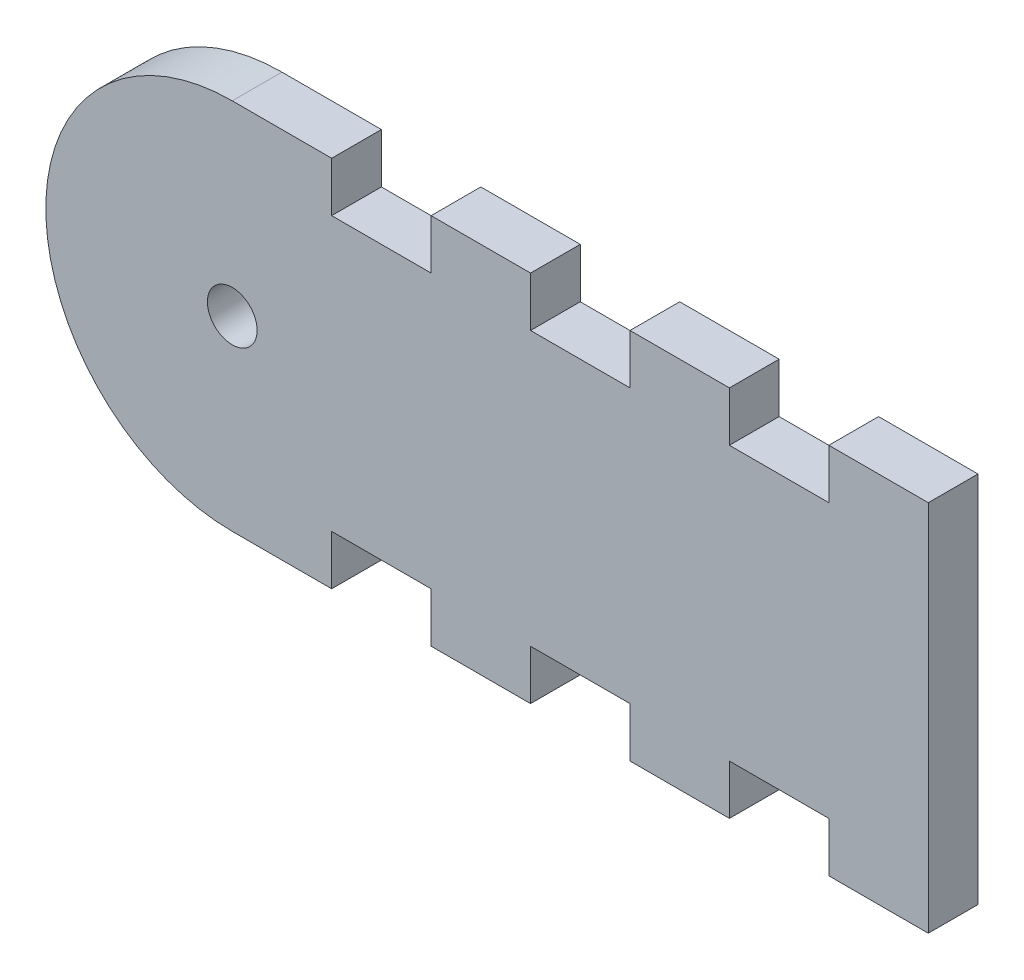
ISO-10303-21;
HEADER;
FILE_DESCRIPTION(('STEP AP214'),'2;1');
FILE_NAME('part.step','',(''),(''),'','','');
FILE_SCHEMA(('AUTOMOTIVE_DESIGN { 1 0 10303 214 1 1 1 1 }'));
ENDSEC;
DATA;
#1=APPLICATION_CONTEXT('core data for automotive mechanical design processes');
#2=APPLICATION_PROTOCOL_DEFINITION('international standard','automotive_design',2000,#1);
#3=PRODUCT_CONTEXT('',#1,'mechanical');
#4=PRODUCT('Part','Part','',(#3));
#5=PRODUCT_RELATED_PRODUCT_CATEGORY('part','',(#4));
#6=PRODUCT_DEFINITION_FORMATION('','',#4);
#7=PRODUCT_DEFINITION_CONTEXT('part definition',#1,'design');
#8=PRODUCT_DEFINITION('design','',#6,#7);
#9=PRODUCT_DEFINITION_SHAPE('','',#8);
#10=(LENGTH_UNIT() NAMED_UNIT(*) SI_UNIT(.MILLI.,.METRE.));
#11=(NAMED_UNIT(*) PLANE_ANGLE_UNIT() SI_UNIT($,.RADIAN.));
#12=(NAMED_UNIT(*) SI_UNIT($,.STERADIAN.) SOLID_ANGLE_UNIT());
#13=UNCERTAINTY_MEASURE_WITH_UNIT(LENGTH_MEASURE(1.E-05),#10,'distance_accuracy_value','');
#14=(GEOMETRIC_REPRESENTATION_CONTEXT(3) GLOBAL_UNCERTAINTY_ASSIGNED_CONTEXT((#13)) GLOBAL_UNIT_ASSIGNED_CONTEXT((#10,
#11,#12)) REPRESENTATION_CONTEXT('',''));
#15=CARTESIAN_POINT('',(0.,0.,0.));
#16=DIRECTION('',(0.,0.,1.));
#17=DIRECTION('',(1.,0.,0.));
#18=AXIS2_PLACEMENT_3D('',#15,#16,#17);
#19=CARTESIAN_POINT('',(-44.45,-23.8125,6.35));
#20=DIRECTION('',(0.,1.,0.));
#21=DIRECTION('',(0.,0.,1.));
#22=AXIS2_PLACEMENT_3D('',#19,#20,#21);
#23=PLANE('',#22);
#24=DIRECTION('',(1.,0.,0.));
#25=VECTOR('',#24,1.);
#26=CARTESIAN_POINT('',(-44.45,-23.8125,6.35));
#27=LINE('',#26,#25);
#28=CARTESIAN_POINT('',(-19.05,-23.8125,6.35));
#29=VERTEX_POINT('',#28);
#30=CARTESIAN_POINT('',(-6.34999999999997,-23.8125,6.35));
#31=VERTEX_POINT('',#30);
#32=EDGE_CURVE('E392',#29,#31,#27,.T.);
#33=ORIENTED_EDGE('',*,*,#32,.F.);
#34=DIRECTION('',(0.,0.,-1.));
#35=VECTOR('',#34,1.);
#36=CARTESIAN_POINT('',(-19.05,-23.8125,6.35));
#37=LINE('',#36,#35);
#38=CARTESIAN_POINT('',(-19.05,-23.8125,0.));
#39=VERTEX_POINT('',#38);
#40=EDGE_CURVE('E248',#29,#39,#37,.T.);
#41=ORIENTED_EDGE('',*,*,#40,.T.);
#42=DIRECTION('',(1.,0.,0.));
#43=VECTOR('',#42,1.);
#44=CARTESIAN_POINT('',(-44.45,-23.8125,0.));
#45=LINE('',#44,#43);
#46=CARTESIAN_POINT('',(-6.34999999999997,-23.8125,0.));
#47=VERTEX_POINT('',#46);
#48=EDGE_CURVE('E405',#39,#47,#45,.T.);
#49=ORIENTED_EDGE('',*,*,#48,.T.);
#50=DIRECTION('',(0.,0.,1.));
#51=VECTOR('',#50,1.);
#52=CARTESIAN_POINT('',(-6.34999999999997,-23.8125,6.35));
#53=LINE('',#52,#51);
#54=EDGE_CURVE('E290',#47,#31,#53,.T.);
#55=ORIENTED_EDGE('',*,*,#54,.T.);
#56=EDGE_LOOP('',(#33,#41,#49,#55));
#57=FACE_BOUND('',#56,.T.);
#58=ADVANCED_FACE('F33',(#57),#23,.F.);
#59=CARTESIAN_POINT('',(-44.45,23.8125,6.35));
#60=DIRECTION('',(0.,-1.,0.));
#61=DIRECTION('',(1.,0.,0.));
#62=AXIS2_PLACEMENT_3D('',#59,#60,#61);
#63=PLANE('',#62);
#64=DIRECTION('',(-1.,0.,0.));
#65=VECTOR('',#64,1.);
#66=CARTESIAN_POINT('',(-44.45,23.8125,0.));
#67=LINE('',#66,#65);
#68=CARTESIAN_POINT('',(-6.34999999999998,23.8125,0.));
#69=VERTEX_POINT('',#68);
#70=CARTESIAN_POINT('',(-19.05,23.8125,0.));
#71=VERTEX_POINT('',#70);
#72=EDGE_CURVE('E436',#69,#71,#67,.T.);
#73=ORIENTED_EDGE('',*,*,#72,.T.);
#74=DIRECTION('',(0.,0.,1.));
#75=VECTOR('',#74,1.);
#76=CARTESIAN_POINT('',(-19.05,23.8125,6.35));
#77=LINE('',#76,#75);
#78=CARTESIAN_POINT('',(-19.05,23.8125,6.35));
#79=VERTEX_POINT('',#78);
#80=EDGE_CURVE('E270',#71,#79,#77,.T.);
#81=ORIENTED_EDGE('',*,*,#80,.T.);
#82=DIRECTION('',(-1.,0.,0.));
#83=VECTOR('',#82,1.);
#84=CARTESIAN_POINT('',(-44.45,23.8125,6.35));
#85=LINE('',#84,#83);
#86=CARTESIAN_POINT('',(-6.34999999999998,23.8125,6.35));
#87=VERTEX_POINT('',#86);
#88=EDGE_CURVE('E512',#87,#79,#85,.T.);
#89=ORIENTED_EDGE('',*,*,#88,.F.);
#90=DIRECTION('',(0.,0.,-1.));
#91=VECTOR('',#90,1.);
#92=CARTESIAN_POINT('',(-6.34999999999998,23.8125,6.35));
#93=LINE('',#92,#91);
#94=EDGE_CURVE('E315',#87,#69,#93,.T.);
#95=ORIENTED_EDGE('',*,*,#94,.T.);
#96=EDGE_LOOP('',(#73,#81,#89,#95));
#97=FACE_BOUND('',#96,.T.);
#98=ADVANCED_FACE('F440',(#97),#63,.F.);
#99=CARTESIAN_POINT('',(6.35000000000002,-23.8125,6.35));
#100=VERTEX_POINT('',#99);
#101=CARTESIAN_POINT('',(19.05,-23.8125,6.35));
#102=VERTEX_POINT('',#101);
#103=EDGE_CURVE('E487',#100,#102,#27,.T.);
#104=ORIENTED_EDGE('',*,*,#103,.F.);
#105=DIRECTION('',(0.,0.,-1.));
#106=VECTOR('',#105,1.);
#107=CARTESIAN_POINT('',(6.35000000000002,-23.8125,6.35));
#108=LINE('',#107,#106);
#109=CARTESIAN_POINT('',(6.35000000000002,-23.8125,0.));
#110=VERTEX_POINT('',#109);
#111=EDGE_CURVE('E295',#100,#110,#108,.T.);
#112=ORIENTED_EDGE('',*,*,#111,.T.);
#113=CARTESIAN_POINT('',(19.05,-23.8125,0.));
#114=VERTEX_POINT('',#113);
#115=EDGE_CURVE('E768',#110,#114,#45,.T.);
#116=ORIENTED_EDGE('',*,*,#115,.T.);
#117=DIRECTION('',(0.,0.,1.));
#118=VECTOR('',#117,1.);
#119=CARTESIAN_POINT('',(19.05,-23.8125,6.35));
#120=LINE('',#119,#118);
#121=EDGE_CURVE('E339',#114,#102,#120,.T.);
#122=ORIENTED_EDGE('',*,*,#121,.T.);
#123=EDGE_LOOP('',(#104,#112,#116,#122));
#124=FACE_BOUND('',#123,.T.);
#125=ADVANCED_FACE('F469',(#124),#23,.F.);
#126=CARTESIAN_POINT('',(19.05,23.8125,0.));
#127=VERTEX_POINT('',#126);
#128=CARTESIAN_POINT('',(6.35000000000002,23.8125,0.));
#129=VERTEX_POINT('',#128);
#130=EDGE_CURVE('E400',#127,#129,#67,.T.);
#131=ORIENTED_EDGE('',*,*,#130,.T.);
#132=DIRECTION('',(0.,0.,1.));
#133=VECTOR('',#132,1.);
#134=CARTESIAN_POINT('',(6.35000000000002,23.8125,6.35));
#135=LINE('',#134,#133);
#136=CARTESIAN_POINT('',(6.35000000000002,23.8125,6.35));
#137=VERTEX_POINT('',#136);
#138=EDGE_CURVE('E319',#129,#137,#135,.T.);
#139=ORIENTED_EDGE('',*,*,#138,.T.);
#140=CARTESIAN_POINT('',(19.05,23.8125,6.35));
#141=VERTEX_POINT('',#140);
#142=EDGE_CURVE('E387',#141,#137,#85,.T.);
#143=ORIENTED_EDGE('',*,*,#142,.F.);
#144=DIRECTION('',(0.,0.,-1.));
#145=VECTOR('',#144,1.);
#146=CARTESIAN_POINT('',(19.05,23.8125,6.35));
#147=LINE('',#146,#145);
#148=EDGE_CURVE('E364',#141,#127,#147,.T.);
#149=ORIENTED_EDGE('',*,*,#148,.T.);
#150=EDGE_LOOP('',(#131,#139,#143,#149));
#151=FACE_BOUND('',#150,.T.);
#152=ADVANCED_FACE('F472',(#151),#63,.F.);
#153=CARTESIAN_POINT('',(31.75,-23.8125,6.35));
#154=VERTEX_POINT('',#153);
#155=CARTESIAN_POINT('',(44.45,-23.8125,6.35));
#156=VERTEX_POINT('',#155);
#157=EDGE_CURVE('E389',#154,#156,#27,.T.);
#158=ORIENTED_EDGE('',*,*,#157,.F.);
#159=DIRECTION('',(0.,0.,-1.));
#160=VECTOR('',#159,1.);
#161=CARTESIAN_POINT('',(31.75,-23.8125,6.35));
#162=LINE('',#161,#160);
#163=CARTESIAN_POINT('',(31.75,-23.8125,0.));
#164=VERTEX_POINT('',#163);
#165=EDGE_CURVE('E344',#154,#164,#162,.T.);
#166=ORIENTED_EDGE('',*,*,#165,.T.);
#167=CARTESIAN_POINT('',(44.45,-23.8125,0.));
#168=VERTEX_POINT('',#167);
#169=EDGE_CURVE('E402',#164,#168,#45,.T.);
#170=ORIENTED_EDGE('',*,*,#169,.T.);
#171=DIRECTION('',(0.,0.,-1.));
#172=VECTOR('',#171,1.);
#173=CARTESIAN_POINT('',(44.45,-23.8125,6.35));
#174=LINE('',#173,#172);
#175=EDGE_CURVE('E391',#156,#168,#174,.T.);
#176=ORIENTED_EDGE('',*,*,#175,.F.);
#177=EDGE_LOOP('',(#158,#166,#170,#176));
#178=FACE_BOUND('',#177,.T.);
#179=ADVANCED_FACE('F459',(#178),#23,.F.);
#180=CARTESIAN_POINT('',(44.45,23.8125,0.));
#181=VERTEX_POINT('',#180);
#182=CARTESIAN_POINT('',(31.75,23.8125,0.));
#183=VERTEX_POINT('',#182);
#184=EDGE_CURVE('E396',#181,#183,#67,.T.);
#185=ORIENTED_EDGE('',*,*,#184,.T.);
#186=DIRECTION('',(0.,0.,1.));
#187=VECTOR('',#186,1.);
#188=CARTESIAN_POINT('',(31.75,23.8125,6.35));
#189=LINE('',#188,#187);
#190=CARTESIAN_POINT('',(31.75,23.8125,6.35));
#191=VERTEX_POINT('',#190);
#192=EDGE_CURVE('E368',#183,#191,#189,.T.);
#193=ORIENTED_EDGE('',*,*,#192,.T.);
#194=CARTESIAN_POINT('',(44.45,23.8125,6.35));
#195=VERTEX_POINT('',#194);
#196=EDGE_CURVE('E383',#195,#191,#85,.T.);
#197=ORIENTED_EDGE('',*,*,#196,.F.);
#198=DIRECTION('',(0.,0.,-1.));
#199=VECTOR('',#198,1.);
#200=CARTESIAN_POINT('',(44.45,23.8125,6.35));
#201=LINE('',#200,#199);
#202=EDGE_CURVE('E414',#195,#181,#201,.T.);
#203=ORIENTED_EDGE('',*,*,#202,.T.);
#204=EDGE_LOOP('',(#185,#193,#197,#203));
#205=FACE_BOUND('',#204,.T.);
#206=ADVANCED_FACE('F471',(#205),#63,.F.);
#207=CARTESIAN_POINT('',(44.45,-23.8125,6.35));
#208=DIRECTION('',(-1.,0.,0.));
#209=DIRECTION('',(0.,-1.,0.));
#210=AXIS2_PLACEMENT_3D('',#207,#208,#209);
#211=PLANE('',#210);
#212=DIRECTION('',(0.,1.,0.));
#213=VECTOR('',#212,1.);
#214=CARTESIAN_POINT('',(44.45,-23.8125,0.));
#215=LINE('',#214,#213);
#216=EDGE_CURVE('E375',#168,#181,#215,.T.);
#217=ORIENTED_EDGE('',*,*,#216,.T.);
#218=ORIENTED_EDGE('',*,*,#202,.F.);
#219=DIRECTION('',(0.,1.,0.));
#220=VECTOR('',#219,1.);
#221=CARTESIAN_POINT('',(44.45,-23.8125,6.35));
#222=LINE('',#221,#220);
#223=EDGE_CURVE('E378',#156,#195,#222,.T.);
#224=ORIENTED_EDGE('',*,*,#223,.F.);
#225=ORIENTED_EDGE('',*,*,#175,.T.);
#226=EDGE_LOOP('',(#217,#218,#224,#225));
#227=FACE_BOUND('',#226,.T.);
#228=ADVANCED_FACE('F35',(#227),#211,.F.);
#229=CARTESIAN_POINT('',(-31.75,23.8125,6.35));
#230=VERTEX_POINT('',#229);
#231=CARTESIAN_POINT('',(-44.45,23.8125,6.35));
#232=VERTEX_POINT('',#231);
#233=EDGE_CURVE('E381',#230,#232,#85,.T.);
#234=ORIENTED_EDGE('',*,*,#233,.F.);
#235=DIRECTION('',(0.,0.,-1.));
#236=VECTOR('',#235,1.);
#237=CARTESIAN_POINT('',(-31.75,23.8125,6.35));
#238=LINE('',#237,#236);
#239=CARTESIAN_POINT('',(-31.75,23.8125,0.));
#240=VERTEX_POINT('',#239);
#241=EDGE_CURVE('E266',#230,#240,#238,.T.);
#242=ORIENTED_EDGE('',*,*,#241,.T.);
#243=CARTESIAN_POINT('',(-44.45,23.8125,0.));
#244=VERTEX_POINT('',#243);
#245=EDGE_CURVE('E395',#240,#244,#67,.T.);
#246=ORIENTED_EDGE('',*,*,#245,.T.);
#247=DIRECTION('',(0.,0.,-1.));
#248=VECTOR('',#247,1.);
#249=CARTESIAN_POINT('',(-44.45,23.8125,6.35));
#250=LINE('',#249,#248);
#251=EDGE_CURVE('E411',#232,#244,#250,.T.);
#252=ORIENTED_EDGE('',*,*,#251,.F.);
#253=EDGE_LOOP('',(#234,#242,#246,#252));
#254=FACE_BOUND('',#253,.T.);
#255=ADVANCED_FACE('F448',(#254),#63,.F.);
#256=CARTESIAN_POINT('',(-44.45,0.,6.35));
#257=DIRECTION('',(0.,0.,-1.));
#258=DIRECTION('',(-1.,0.,0.));
#259=AXIS2_PLACEMENT_3D('',#256,#257,#258);
#260=CYLINDRICAL_SURFACE('',#259,23.8125);
#261=CARTESIAN_POINT('',(-44.45,0.,0.));
#262=DIRECTION('',(0.,0.,1.));
#263=DIRECTION('',(1.,0.,0.));
#264=AXIS2_PLACEMENT_3D('',#261,#262,#263);
#265=CIRCLE('',#264,23.8125);
#266=CARTESIAN_POINT('',(-44.45,-23.8125,0.));
#267=VERTEX_POINT('',#266);
#268=EDGE_CURVE('E399',#244,#267,#265,.T.);
#269=ORIENTED_EDGE('',*,*,#268,.T.);
#270=DIRECTION('',(0.,0.,-1.));
#271=VECTOR('',#270,1.);
#272=CARTESIAN_POINT('',(-44.45,-23.8125,6.35));
#273=LINE('',#272,#271);
#274=CARTESIAN_POINT('',(-44.45,-23.8125,6.35));
#275=VERTEX_POINT('',#274);
#276=EDGE_CURVE('E408',#275,#267,#273,.T.);
#277=ORIENTED_EDGE('',*,*,#276,.F.);
#278=CARTESIAN_POINT('',(-44.45,0.,6.35));
#279=DIRECTION('',(0.,0.,1.));
#280=DIRECTION('',(1.,0.,0.));
#281=AXIS2_PLACEMENT_3D('',#278,#279,#280);
#282=CIRCLE('',#281,23.8125);
#283=EDGE_CURVE('E386',#232,#275,#282,.T.);
#284=ORIENTED_EDGE('',*,*,#283,.F.);
#285=ORIENTED_EDGE('',*,*,#251,.T.);
#286=EDGE_LOOP('',(#269,#277,#284,#285));
#287=FACE_BOUND('',#286,.T.);
#288=ADVANCED_FACE('F452',(#287),#260,.T.);
#289=CARTESIAN_POINT('',(-31.75,-23.8125,0.));
#290=VERTEX_POINT('',#289);
#291=EDGE_CURVE('E382',#267,#290,#45,.T.);
#292=ORIENTED_EDGE('',*,*,#291,.T.);
#293=DIRECTION('',(0.,0.,1.));
#294=VECTOR('',#293,1.);
#295=CARTESIAN_POINT('',(-31.75,-23.8125,6.35));
#296=LINE('',#295,#294);
#297=CARTESIAN_POINT('',(-31.75,-23.8125,6.35));
#298=VERTEX_POINT('',#297);
#299=EDGE_CURVE('E48',#290,#298,#296,.T.);
#300=ORIENTED_EDGE('',*,*,#299,.T.);
#301=EDGE_CURVE('E237',#275,#298,#27,.T.);
#302=ORIENTED_EDGE('',*,*,#301,.F.);
#303=ORIENTED_EDGE('',*,*,#276,.T.);
#304=EDGE_LOOP('',(#292,#300,#302,#303));
#305=FACE_BOUND('',#304,.T.);
#306=ADVANCED_FACE('F456',(#305),#23,.F.);
#307=CARTESIAN_POINT('',(-44.45,0.,6.35));
#308=DIRECTION('',(0.,0.,1.));
#309=DIRECTION('',(1.,0.,0.));
#310=AXIS2_PLACEMENT_3D('',#307,#308,#309);
#311=PLANE('',#310);
#312=DIRECTION('',(0.,-1.,0.));
#313=VECTOR('',#312,1.);
#314=CARTESIAN_POINT('',(-19.05,-30.1625,6.35));
#315=LINE('',#314,#313);
#316=CARTESIAN_POINT('',(-19.05,-17.4625,6.35));
#317=VERTEX_POINT('',#316);
#318=EDGE_CURVE('E238',#317,#29,#315,.T.);
#319=ORIENTED_EDGE('',*,*,#318,.T.);
#320=ORIENTED_EDGE('',*,*,#32,.T.);
#321=DIRECTION('',(0.,1.,0.));
#322=VECTOR('',#321,1.);
#323=CARTESIAN_POINT('',(-6.34999999999996,-30.1625,6.35));
#324=LINE('',#323,#322);
#325=CARTESIAN_POINT('',(-6.34999999999997,-17.4625,6.35));
#326=VERTEX_POINT('',#325);
#327=EDGE_CURVE('E277',#31,#326,#324,.T.);
#328=ORIENTED_EDGE('',*,*,#327,.T.);
#329=DIRECTION('',(1.,0.,0.));
#330=VECTOR('',#329,1.);
#331=CARTESIAN_POINT('',(-6.34999999999997,-17.4625,6.35));
#332=LINE('',#331,#330);
#333=CARTESIAN_POINT('',(6.35000000000002,-17.4625,6.35));
#334=VERTEX_POINT('',#333);
#335=EDGE_CURVE('E281',#326,#334,#332,.T.);
#336=ORIENTED_EDGE('',*,*,#335,.T.);
#337=DIRECTION('',(0.,-1.,0.));
#338=VECTOR('',#337,1.);
#339=CARTESIAN_POINT('',(6.35000000000002,-30.1625,6.35));
#340=LINE('',#339,#338);
#341=EDGE_CURVE('E274',#334,#100,#340,.T.);
#342=ORIENTED_EDGE('',*,*,#341,.T.);
#343=ORIENTED_EDGE('',*,*,#103,.T.);
#344=DIRECTION('',(0.,1.,0.));
#345=VECTOR('',#344,1.);
#346=CARTESIAN_POINT('',(19.05,-30.1625,6.35));
#347=LINE('',#346,#345);
#348=CARTESIAN_POINT('',(19.05,-17.4625,6.35));
#349=VERTEX_POINT('',#348);
#350=EDGE_CURVE('E326',#102,#349,#347,.T.);
#351=ORIENTED_EDGE('',*,*,#350,.T.);
#352=DIRECTION('',(1.,0.,0.));
#353=VECTOR('',#352,1.);
#354=CARTESIAN_POINT('',(19.05,-17.4625,6.35));
#355=LINE('',#354,#353);
#356=CARTESIAN_POINT('',(31.75,-17.4625,6.35));
#357=VERTEX_POINT('',#356);
#358=EDGE_CURVE('E330',#349,#357,#355,.T.);
#359=ORIENTED_EDGE('',*,*,#358,.T.);
#360=DIRECTION('',(0.,-1.,0.));
#361=VECTOR('',#360,1.);
#362=CARTESIAN_POINT('',(31.75,-30.1625,6.35));
#363=LINE('',#362,#361);
#364=EDGE_CURVE('E323',#357,#154,#363,.T.);
#365=ORIENTED_EDGE('',*,*,#364,.T.);
#366=ORIENTED_EDGE('',*,*,#157,.T.);
#367=ORIENTED_EDGE('',*,*,#223,.T.);
#368=ORIENTED_EDGE('',*,*,#196,.T.);
#369=DIRECTION('',(0.,-1.,0.));
#370=VECTOR('',#369,1.);
#371=CARTESIAN_POINT('',(31.75,17.4625,6.35));
#372=LINE('',#371,#370);
#373=CARTESIAN_POINT('',(31.75,17.4625,6.35));
#374=VERTEX_POINT('',#373);
#375=EDGE_CURVE('E348',#191,#374,#372,.T.);
#376=ORIENTED_EDGE('',*,*,#375,.T.);
#377=DIRECTION('',(-1.,0.,0.));
#378=VECTOR('',#377,1.);
#379=CARTESIAN_POINT('',(19.05,17.4625,6.35));
#380=LINE('',#379,#378);
#381=CARTESIAN_POINT('',(19.05,17.4625,6.35));
#382=VERTEX_POINT('',#381);
#383=EDGE_CURVE('E351',#374,#382,#380,.T.);
#384=ORIENTED_EDGE('',*,*,#383,.T.);
#385=DIRECTION('',(0.,1.,0.));
#386=VECTOR('',#385,1.);
#387=CARTESIAN_POINT('',(19.05,17.4625,6.35));
#388=LINE('',#387,#386);
#389=EDGE_CURVE('E355',#382,#141,#388,.T.);
#390=ORIENTED_EDGE('',*,*,#389,.T.);
#391=ORIENTED_EDGE('',*,*,#142,.T.);
#392=DIRECTION('',(0.,-1.,0.));
#393=VECTOR('',#392,1.);
#394=CARTESIAN_POINT('',(6.35000000000002,17.4625,6.35));
#395=LINE('',#394,#393);
#396=CARTESIAN_POINT('',(6.35000000000002,17.4625,6.35));
#397=VERTEX_POINT('',#396);
#398=EDGE_CURVE('E299',#137,#397,#395,.T.);
#399=ORIENTED_EDGE('',*,*,#398,.T.);
#400=DIRECTION('',(-1.,0.,0.));
#401=VECTOR('',#400,1.);
#402=CARTESIAN_POINT('',(-6.34999999999998,17.4625,6.35));
#403=LINE('',#402,#401);
#404=CARTESIAN_POINT('',(-6.34999999999998,17.4625,6.35));
#405=VERTEX_POINT('',#404);
#406=EDGE_CURVE('E302',#397,#405,#403,.T.);
#407=ORIENTED_EDGE('',*,*,#406,.T.);
#408=DIRECTION('',(0.,1.,0.));
#409=VECTOR('',#408,1.);
#410=CARTESIAN_POINT('',(-6.34999999999998,17.4625,6.35));
#411=LINE('',#410,#409);
#412=EDGE_CURVE('E306',#405,#87,#411,.T.);
#413=ORIENTED_EDGE('',*,*,#412,.T.);
#414=ORIENTED_EDGE('',*,*,#88,.T.);
#415=DIRECTION('',(0.,-1.,0.));
#416=VECTOR('',#415,1.);
#417=CARTESIAN_POINT('',(-19.05,17.4625,6.35));
#418=LINE('',#417,#416);
#419=CARTESIAN_POINT('',(-19.05,17.4625,6.35));
#420=VERTEX_POINT('',#419);
#421=EDGE_CURVE('E252',#79,#420,#418,.T.);
#422=ORIENTED_EDGE('',*,*,#421,.T.);
#423=DIRECTION('',(-1.,0.,0.));
#424=VECTOR('',#423,1.);
#425=CARTESIAN_POINT('',(-31.75,17.4625,6.35));
#426=LINE('',#425,#424);
#427=CARTESIAN_POINT('',(-31.75,17.4625,6.35));
#428=VERTEX_POINT('',#427);
#429=EDGE_CURVE('E255',#420,#428,#426,.T.);
#430=ORIENTED_EDGE('',*,*,#429,.T.);
#431=DIRECTION('',(0.,1.,0.));
#432=VECTOR('',#431,1.);
#433=CARTESIAN_POINT('',(-31.75,17.4625,6.35));
#434=LINE('',#433,#432);
#435=EDGE_CURVE('E259',#428,#230,#434,.T.);
#436=ORIENTED_EDGE('',*,*,#435,.T.);
#437=ORIENTED_EDGE('',*,*,#233,.T.);
#438=ORIENTED_EDGE('',*,*,#283,.T.);
#439=ORIENTED_EDGE('',*,*,#301,.T.);
#440=DIRECTION('',(0.,1.,0.));
#441=VECTOR('',#440,1.);
#442=CARTESIAN_POINT('',(-31.75,-30.1625,6.35));
#443=LINE('',#442,#441);
#444=CARTESIAN_POINT('',(-31.75,-17.4625,6.35));
#445=VERTEX_POINT('',#444);
#446=EDGE_CURVE('E220',#298,#445,#443,.T.);
#447=ORIENTED_EDGE('',*,*,#446,.T.);
#448=DIRECTION('',(1.,0.,0.));
#449=VECTOR('',#448,1.);
#450=CARTESIAN_POINT('',(-31.75,-17.4625,6.35));
#451=LINE('',#450,#449);
#452=EDGE_CURVE('E225',#445,#317,#451,.T.);
#453=ORIENTED_EDGE('',*,*,#452,.T.);
#454=EDGE_LOOP('',(#319,#320,#328,#336,#342,#343,#351,#359,#365,#366,#367,#368,#376,#384,#390,
#391,#399,#407,#413,#414,#422,#430,#436,#437,#438,#439,#447,#453));
#455=FACE_BOUND('',#454,.T.);
#456=CARTESIAN_POINT('',(-44.45,0.,6.35));
#457=DIRECTION('',(0.,0.,-1.));
#458=DIRECTION('',(-1.,0.,0.));
#459=AXIS2_PLACEMENT_3D('',#456,#457,#458);
#460=CIRCLE('',#459,3.175);
#461=CARTESIAN_POINT('',(-47.625,0.,6.35));
#462=VERTEX_POINT('',#461);
#463=EDGE_CURVE('E372',#462,#462,#460,.T.);
#464=ORIENTED_EDGE('',*,*,#463,.T.);
#465=EDGE_LOOP('',(#464));
#466=FACE_BOUND('',#465,.T.);
#467=ADVANCED_FACE('F234',(#455,#466),#311,.T.);
#468=CARTESIAN_POINT('',(-44.45,0.,0.));
#469=DIRECTION('',(0.,0.,1.));
#470=DIRECTION('',(1.,0.,0.));
#471=AXIS2_PLACEMENT_3D('',#468,#469,#470);
#472=PLANE('',#471);
#473=CARTESIAN_POINT('',(-44.45,0.,0.));
#474=DIRECTION('',(0.,0.,-1.));
#475=DIRECTION('',(-1.,0.,0.));
#476=AXIS2_PLACEMENT_3D('',#473,#474,#475);
#477=CIRCLE('',#476,3.175);
#478=CARTESIAN_POINT('',(-47.625,0.,0.));
#479=VERTEX_POINT('',#478);
#480=EDGE_CURVE('E371',#479,#479,#477,.T.);
#481=ORIENTED_EDGE('',*,*,#480,.F.);
#482=EDGE_LOOP('',(#481));
#483=FACE_BOUND('',#482,.T.);
#484=ORIENTED_EDGE('',*,*,#48,.F.);
#485=DIRECTION('',(0.,-1.,0.));
#486=VECTOR('',#485,1.);
#487=CARTESIAN_POINT('',(-19.05,-30.1625,0.));
#488=LINE('',#487,#486);
#489=CARTESIAN_POINT('',(-19.05,-17.4625,0.));
#490=VERTEX_POINT('',#489);
#491=EDGE_CURVE('E243',#490,#39,#488,.T.);
#492=ORIENTED_EDGE('',*,*,#491,.F.);
#493=DIRECTION('',(1.,0.,0.));
#494=VECTOR('',#493,1.);
#495=CARTESIAN_POINT('',(-31.75,-17.4625,0.));
#496=LINE('',#495,#494);
#497=CARTESIAN_POINT('',(-31.75,-17.4625,0.));
#498=VERTEX_POINT('',#497);
#499=EDGE_CURVE('E240',#498,#490,#496,.T.);
#500=ORIENTED_EDGE('',*,*,#499,.F.);
#501=DIRECTION('',(0.,-1.,0.));
#502=VECTOR('',#501,1.);
#503=CARTESIAN_POINT('',(-31.75,0.,0.));
#504=LINE('',#503,#502);
#505=EDGE_CURVE('E11',#498,#290,#504,.T.);
#506=ORIENTED_EDGE('',*,*,#505,.T.);
#507=ORIENTED_EDGE('',*,*,#291,.F.);
#508=ORIENTED_EDGE('',*,*,#268,.F.);
#509=ORIENTED_EDGE('',*,*,#245,.F.);
#510=DIRECTION('',(0.,1.,0.));
#511=VECTOR('',#510,1.);
#512=CARTESIAN_POINT('',(-31.75,17.4625,0.));
#513=LINE('',#512,#511);
#514=CARTESIAN_POINT('',(-31.75,17.4625,0.));
#515=VERTEX_POINT('',#514);
#516=EDGE_CURVE('E256',#515,#240,#513,.T.);
#517=ORIENTED_EDGE('',*,*,#516,.F.);
#518=DIRECTION('',(-1.,0.,0.));
#519=VECTOR('',#518,1.);
#520=CARTESIAN_POINT('',(-31.75,17.4625,0.));
#521=LINE('',#520,#519);
#522=CARTESIAN_POINT('',(-19.05,17.4625,0.));
#523=VERTEX_POINT('',#522);
#524=EDGE_CURVE('E251',#523,#515,#521,.T.);
#525=ORIENTED_EDGE('',*,*,#524,.F.);
#526=DIRECTION('',(0.,1.,0.));
#527=VECTOR('',#526,1.);
#528=CARTESIAN_POINT('',(-19.05,0.,0.));
#529=LINE('',#528,#527);
#530=EDGE_CURVE('E41',#523,#71,#529,.T.);
#531=ORIENTED_EDGE('',*,*,#530,.T.);
#532=ORIENTED_EDGE('',*,*,#72,.F.);
#533=DIRECTION('',(0.,1.,0.));
#534=VECTOR('',#533,1.);
#535=CARTESIAN_POINT('',(-6.34999999999998,17.4625,0.));
#536=LINE('',#535,#534);
#537=CARTESIAN_POINT('',(-6.34999999999998,17.4625,0.));
#538=VERTEX_POINT('',#537);
#539=EDGE_CURVE('E303',#538,#69,#536,.T.);
#540=ORIENTED_EDGE('',*,*,#539,.F.);
#541=DIRECTION('',(-1.,0.,0.));
#542=VECTOR('',#541,1.);
#543=CARTESIAN_POINT('',(-6.34999999999998,17.4625,0.));
#544=LINE('',#543,#542);
#545=CARTESIAN_POINT('',(6.35000000000002,17.4625,0.));
#546=VERTEX_POINT('',#545);
#547=EDGE_CURVE('E298',#546,#538,#544,.T.);
#548=ORIENTED_EDGE('',*,*,#547,.F.);
#549=DIRECTION('',(0.,1.,0.));
#550=VECTOR('',#549,1.);
#551=CARTESIAN_POINT('',(6.35000000000001,0.,0.));
#552=LINE('',#551,#550);
#553=EDGE_CURVE('E423',#546,#129,#552,.T.);
#554=ORIENTED_EDGE('',*,*,#553,.T.);
#555=ORIENTED_EDGE('',*,*,#130,.F.);
#556=DIRECTION('',(0.,1.,0.));
#557=VECTOR('',#556,1.);
#558=CARTESIAN_POINT('',(19.05,17.4625,0.));
#559=LINE('',#558,#557);
#560=CARTESIAN_POINT('',(19.05,17.4625,0.));
#561=VERTEX_POINT('',#560);
#562=EDGE_CURVE('E352',#561,#127,#559,.T.);
#563=ORIENTED_EDGE('',*,*,#562,.F.);
#564=DIRECTION('',(-1.,0.,0.));
#565=VECTOR('',#564,1.);
#566=CARTESIAN_POINT('',(19.05,17.4625,0.));
#567=LINE('',#566,#565);
#568=CARTESIAN_POINT('',(31.75,17.4625,0.));
#569=VERTEX_POINT('',#568);
#570=EDGE_CURVE('E347',#569,#561,#567,.T.);
#571=ORIENTED_EDGE('',*,*,#570,.F.);
#572=DIRECTION('',(0.,1.,0.));
#573=VECTOR('',#572,1.);
#574=CARTESIAN_POINT('',(31.75,0.,0.));
#575=LINE('',#574,#573);
#576=EDGE_CURVE('E417',#569,#183,#575,.T.);
#577=ORIENTED_EDGE('',*,*,#576,.T.);
#578=ORIENTED_EDGE('',*,*,#184,.F.);
#579=ORIENTED_EDGE('',*,*,#216,.F.);
#580=ORIENTED_EDGE('',*,*,#169,.F.);
#581=DIRECTION('',(0.,-1.,0.));
#582=VECTOR('',#581,1.);
#583=CARTESIAN_POINT('',(31.75,-30.1625,0.));
#584=LINE('',#583,#582);
#585=CARTESIAN_POINT('',(31.75,-17.4625,0.));
#586=VERTEX_POINT('',#585);
#587=EDGE_CURVE('E322',#586,#164,#584,.T.);
#588=ORIENTED_EDGE('',*,*,#587,.F.);
#589=DIRECTION('',(1.,0.,0.));
#590=VECTOR('',#589,1.);
#591=CARTESIAN_POINT('',(19.05,-17.4625,0.));
#592=LINE('',#591,#590);
#593=CARTESIAN_POINT('',(19.05,-17.4625,0.));
#594=VERTEX_POINT('',#593);
#595=EDGE_CURVE('E327',#594,#586,#592,.T.);
#596=ORIENTED_EDGE('',*,*,#595,.F.);
#597=DIRECTION('',(0.,-1.,0.));
#598=VECTOR('',#597,1.);
#599=CARTESIAN_POINT('',(19.05,0.,0.));
#600=LINE('',#599,#598);
#601=EDGE_CURVE('E420',#594,#114,#600,.T.);
#602=ORIENTED_EDGE('',*,*,#601,.T.);
#603=ORIENTED_EDGE('',*,*,#115,.F.);
#604=DIRECTION('',(0.,-1.,0.));
#605=VECTOR('',#604,1.);
#606=CARTESIAN_POINT('',(6.35000000000002,-30.1625,0.));
#607=LINE('',#606,#605);
#608=CARTESIAN_POINT('',(6.35000000000002,-17.4625,0.));
#609=VERTEX_POINT('',#608);
#610=EDGE_CURVE('E273',#609,#110,#607,.T.);
#611=ORIENTED_EDGE('',*,*,#610,.F.);
#612=DIRECTION('',(1.,0.,0.));
#613=VECTOR('',#612,1.);
#614=CARTESIAN_POINT('',(-6.34999999999997,-17.4625,0.));
#615=LINE('',#614,#613);
#616=CARTESIAN_POINT('',(-6.34999999999997,-17.4625,0.));
#617=VERTEX_POINT('',#616);
#618=EDGE_CURVE('E278',#617,#609,#615,.T.);
#619=ORIENTED_EDGE('',*,*,#618,.F.);
#620=DIRECTION('',(0.,-1.,0.));
#621=VECTOR('',#620,1.);
#622=CARTESIAN_POINT('',(-6.34999999999999,0.,0.));
#623=LINE('',#622,#621);
#624=EDGE_CURVE('E426',#617,#47,#623,.T.);
#625=ORIENTED_EDGE('',*,*,#624,.T.);
#626=EDGE_LOOP('',(#484,#492,#500,#506,#507,#508,#509,#517,#525,#531,#532,#540,#548,#554,#555,
#563,#571,#577,#578,#579,#580,#588,#596,#602,#603,#611,#619,#625));
#627=FACE_BOUND('',#626,.T.);
#628=ADVANCED_FACE('F434',(#483,#627),#472,.F.);
#629=CARTESIAN_POINT('',(-44.45,0.,6.35));
#630=DIRECTION('',(0.,0.,-1.));
#631=DIRECTION('',(-1.,0.,0.));
#632=AXIS2_PLACEMENT_3D('',#629,#630,#631);
#633=CYLINDRICAL_SURFACE('',#632,3.175);
#634=ORIENTED_EDGE('',*,*,#463,.F.);
#635=EDGE_LOOP('',(#634));
#636=FACE_BOUND('',#635,.T.);
#637=ORIENTED_EDGE('',*,*,#480,.T.);
#638=EDGE_LOOP('',(#637));
#639=FACE_BOUND('',#638,.T.);
#640=ADVANCED_FACE('F573',(#636,#639),#633,.F.);
#641=CARTESIAN_POINT('',(31.75,17.4625,6.35));
#642=DIRECTION('',(1.,0.,0.));
#643=DIRECTION('',(0.,1.,0.));
#644=AXIS2_PLACEMENT_3D('',#641,#642,#643);
#645=PLANE('',#644);
#646=ORIENTED_EDGE('',*,*,#576,.F.);
#647=DIRECTION('',(0.,0.,-1.));
#648=VECTOR('',#647,1.);
#649=CARTESIAN_POINT('',(31.75,17.4625,6.35));
#650=LINE('',#649,#648);
#651=EDGE_CURVE('E358',#374,#569,#650,.T.);
#652=ORIENTED_EDGE('',*,*,#651,.F.);
#653=ORIENTED_EDGE('',*,*,#375,.F.);
#654=ORIENTED_EDGE('',*,*,#192,.F.);
#655=EDGE_LOOP('',(#646,#652,#653,#654));
#656=FACE_BOUND('',#655,.T.);
#657=ADVANCED_FACE('F501',(#656),#645,.F.);
#658=CARTESIAN_POINT('',(19.05,17.4625,6.35));
#659=DIRECTION('',(-1.,0.,0.));
#660=DIRECTION('',(0.,-1.,0.));
#661=AXIS2_PLACEMENT_3D('',#658,#659,#660);
#662=PLANE('',#661);
#663=ORIENTED_EDGE('',*,*,#389,.F.);
#664=DIRECTION('',(0.,0.,-1.));
#665=VECTOR('',#664,1.);
#666=CARTESIAN_POINT('',(19.05,17.4625,6.35));
#667=LINE('',#666,#665);
#668=EDGE_CURVE('E362',#382,#561,#667,.T.);
#669=ORIENTED_EDGE('',*,*,#668,.T.);
#670=ORIENTED_EDGE('',*,*,#562,.T.);
#671=ORIENTED_EDGE('',*,*,#148,.F.);
#672=EDGE_LOOP('',(#663,#669,#670,#671));
#673=FACE_BOUND('',#672,.T.);
#674=ADVANCED_FACE('F508',(#673),#662,.F.);
#675=CARTESIAN_POINT('',(19.05,17.4625,6.35));
#676=DIRECTION('',(0.,-1.,0.));
#677=DIRECTION('',(0.,0.,-1.));
#678=AXIS2_PLACEMENT_3D('',#675,#676,#677);
#679=PLANE('',#678);
#680=ORIENTED_EDGE('',*,*,#570,.T.);
#681=ORIENTED_EDGE('',*,*,#668,.F.);
#682=ORIENTED_EDGE('',*,*,#383,.F.);
#683=ORIENTED_EDGE('',*,*,#651,.T.);
#684=EDGE_LOOP('',(#680,#681,#682,#683));
#685=FACE_BOUND('',#684,.T.);
#686=ADVANCED_FACE('F504',(#685),#679,.F.);
#687=CARTESIAN_POINT('',(31.75,-30.1625,6.35));
#688=DIRECTION('',(1.,0.,0.));
#689=DIRECTION('',(0.,0.,-1.));
#690=AXIS2_PLACEMENT_3D('',#687,#688,#689);
#691=PLANE('',#690);
#692=ORIENTED_EDGE('',*,*,#364,.F.);
#693=DIRECTION('',(0.,0.,-1.));
#694=VECTOR('',#693,1.);
#695=CARTESIAN_POINT('',(31.75,-17.4625,6.35));
#696=LINE('',#695,#694);
#697=EDGE_CURVE('E337',#357,#586,#696,.T.);
#698=ORIENTED_EDGE('',*,*,#697,.T.);
#699=ORIENTED_EDGE('',*,*,#587,.T.);
#700=ORIENTED_EDGE('',*,*,#165,.F.);
#701=EDGE_LOOP('',(#692,#698,#699,#700));
#702=FACE_BOUND('',#701,.T.);
#703=ADVANCED_FACE('F562',(#702),#691,.F.);
#704=CARTESIAN_POINT('',(19.05,-30.1625,6.35));
#705=DIRECTION('',(-1.,0.,0.));
#706=DIRECTION('',(0.,-1.,0.));
#707=AXIS2_PLACEMENT_3D('',#704,#705,#706);
#708=PLANE('',#707);
#709=ORIENTED_EDGE('',*,*,#601,.F.);
#710=DIRECTION('',(0.,0.,-1.));
#711=VECTOR('',#710,1.);
#712=CARTESIAN_POINT('',(19.05,-17.4625,6.35));
#713=LINE('',#712,#711);
#714=EDGE_CURVE('E333',#349,#594,#713,.T.);
#715=ORIENTED_EDGE('',*,*,#714,.F.);
#716=ORIENTED_EDGE('',*,*,#350,.F.);
#717=ORIENTED_EDGE('',*,*,#121,.F.);
#718=EDGE_LOOP('',(#709,#715,#716,#717));
#719=FACE_BOUND('',#718,.T.);
#720=ADVANCED_FACE('F558',(#719),#708,.F.);
#721=CARTESIAN_POINT('',(19.05,-17.4625,6.35));
#722=DIRECTION('',(0.,1.,0.));
#723=DIRECTION('',(0.,0.,1.));
#724=AXIS2_PLACEMENT_3D('',#721,#722,#723);
#725=PLANE('',#724);
#726=ORIENTED_EDGE('',*,*,#595,.T.);
#727=ORIENTED_EDGE('',*,*,#697,.F.);
#728=ORIENTED_EDGE('',*,*,#358,.F.);
#729=ORIENTED_EDGE('',*,*,#714,.T.);
#730=EDGE_LOOP('',(#726,#727,#728,#729));
#731=FACE_BOUND('',#730,.T.);
#732=ADVANCED_FACE('F554',(#731),#725,.F.);
#733=CARTESIAN_POINT('',(6.35000000000002,17.4625,6.35));
#734=DIRECTION('',(1.,0.,0.));
#735=DIRECTION('',(0.,1.,0.));
#736=AXIS2_PLACEMENT_3D('',#733,#734,#735);
#737=PLANE('',#736);
#738=ORIENTED_EDGE('',*,*,#553,.F.);
#739=DIRECTION('',(0.,0.,-1.));
#740=VECTOR('',#739,1.);
#741=CARTESIAN_POINT('',(6.35000000000002,17.4625,6.35));
#742=LINE('',#741,#740);
#743=EDGE_CURVE('E309',#397,#546,#742,.T.);
#744=ORIENTED_EDGE('',*,*,#743,.F.);
#745=ORIENTED_EDGE('',*,*,#398,.F.);
#746=ORIENTED_EDGE('',*,*,#138,.F.);
#747=EDGE_LOOP('',(#738,#744,#745,#746));
#748=FACE_BOUND('',#747,.T.);
#749=ADVANCED_FACE('F547',(#748),#737,.F.);
#750=CARTESIAN_POINT('',(-6.34999999999998,17.4625,6.35));
#751=DIRECTION('',(-1.,0.,0.));
#752=DIRECTION('',(0.,-1.,0.));
#753=AXIS2_PLACEMENT_3D('',#750,#751,#752);
#754=PLANE('',#753);
#755=ORIENTED_EDGE('',*,*,#412,.F.);
#756=DIRECTION('',(0.,0.,-1.));
#757=VECTOR('',#756,1.);
#758=CARTESIAN_POINT('',(-6.34999999999998,17.4625,6.35));
#759=LINE('',#758,#757);
#760=EDGE_CURVE('E313',#405,#538,#759,.T.);
#761=ORIENTED_EDGE('',*,*,#760,.T.);
#762=ORIENTED_EDGE('',*,*,#539,.T.);
#763=ORIENTED_EDGE('',*,*,#94,.F.);
#764=EDGE_LOOP('',(#755,#761,#762,#763));
#765=FACE_BOUND('',#764,.T.);
#766=ADVANCED_FACE('F544',(#765),#754,.F.);
#767=CARTESIAN_POINT('',(-6.34999999999998,17.4625,6.35));
#768=DIRECTION('',(0.,-1.,0.));
#769=DIRECTION('',(0.,0.,-1.));
#770=AXIS2_PLACEMENT_3D('',#767,#768,#769);
#771=PLANE('',#770);
#772=ORIENTED_EDGE('',*,*,#547,.T.);
#773=ORIENTED_EDGE('',*,*,#760,.F.);
#774=ORIENTED_EDGE('',*,*,#406,.F.);
#775=ORIENTED_EDGE('',*,*,#743,.T.);
#776=EDGE_LOOP('',(#772,#773,#774,#775));
#777=FACE_BOUND('',#776,.T.);
#778=ADVANCED_FACE('F542',(#777),#771,.F.);
#779=CARTESIAN_POINT('',(6.35000000000002,-30.1625,6.35));
#780=DIRECTION('',(1.,0.,0.));
#781=DIRECTION('',(0.,0.,-1.));
#782=AXIS2_PLACEMENT_3D('',#779,#780,#781);
#783=PLANE('',#782);
#784=ORIENTED_EDGE('',*,*,#341,.F.);
#785=DIRECTION('',(0.,0.,-1.));
#786=VECTOR('',#785,1.);
#787=CARTESIAN_POINT('',(6.35000000000002,-17.4625,6.35));
#788=LINE('',#787,#786);
#789=EDGE_CURVE('E288',#334,#609,#788,.T.);
#790=ORIENTED_EDGE('',*,*,#789,.T.);
#791=ORIENTED_EDGE('',*,*,#610,.T.);
#792=ORIENTED_EDGE('',*,*,#111,.F.);
#793=EDGE_LOOP('',(#784,#790,#791,#792));
#794=FACE_BOUND('',#793,.T.);
#795=ADVANCED_FACE('F538',(#794),#783,.F.);
#796=CARTESIAN_POINT('',(-6.34999999999996,-30.1625,6.35));
#797=DIRECTION('',(-1.,0.,0.));
#798=DIRECTION('',(0.,-1.,0.));
#799=AXIS2_PLACEMENT_3D('',#796,#797,#798);
#800=PLANE('',#799);
#801=ORIENTED_EDGE('',*,*,#624,.F.);
#802=DIRECTION('',(0.,0.,-1.));
#803=VECTOR('',#802,1.);
#804=CARTESIAN_POINT('',(-6.34999999999997,-17.4625,6.35));
#805=LINE('',#804,#803);
#806=EDGE_CURVE('E284',#326,#617,#805,.T.);
#807=ORIENTED_EDGE('',*,*,#806,.F.);
#808=ORIENTED_EDGE('',*,*,#327,.F.);
#809=ORIENTED_EDGE('',*,*,#54,.F.);
#810=EDGE_LOOP('',(#801,#807,#808,#809));
#811=FACE_BOUND('',#810,.T.);
#812=ADVANCED_FACE('F534',(#811),#800,.F.);
#813=CARTESIAN_POINT('',(-6.34999999999997,-17.4625,6.35));
#814=DIRECTION('',(0.,1.,0.));
#815=DIRECTION('',(0.,0.,1.));
#816=AXIS2_PLACEMENT_3D('',#813,#814,#815);
#817=PLANE('',#816);
#818=ORIENTED_EDGE('',*,*,#618,.T.);
#819=ORIENTED_EDGE('',*,*,#789,.F.);
#820=ORIENTED_EDGE('',*,*,#335,.F.);
#821=ORIENTED_EDGE('',*,*,#806,.T.);
#822=EDGE_LOOP('',(#818,#819,#820,#821));
#823=FACE_BOUND('',#822,.T.);
#824=ADVANCED_FACE('F531',(#823),#817,.F.);
#825=CARTESIAN_POINT('',(-19.05,17.4625,6.35));
#826=DIRECTION('',(1.,0.,0.));
#827=DIRECTION('',(0.,1.,0.));
#828=AXIS2_PLACEMENT_3D('',#825,#826,#827);
#829=PLANE('',#828);
#830=ORIENTED_EDGE('',*,*,#530,.F.);
#831=DIRECTION('',(0.,0.,-1.));
#832=VECTOR('',#831,1.);
#833=CARTESIAN_POINT('',(-19.05,17.4625,6.35));
#834=LINE('',#833,#832);
#835=EDGE_CURVE('E55',#420,#523,#834,.T.);
#836=ORIENTED_EDGE('',*,*,#835,.F.);
#837=ORIENTED_EDGE('',*,*,#421,.F.);
#838=ORIENTED_EDGE('',*,*,#80,.F.);
#839=EDGE_LOOP('',(#830,#836,#837,#838));
#840=FACE_BOUND('',#839,.T.);
#841=ADVANCED_FACE('F526',(#840),#829,.F.);
#842=CARTESIAN_POINT('',(-31.75,17.4625,6.35));
#843=DIRECTION('',(-1.,0.,0.));
#844=DIRECTION('',(0.,-1.,0.));
#845=AXIS2_PLACEMENT_3D('',#842,#843,#844);
#846=PLANE('',#845);
#847=ORIENTED_EDGE('',*,*,#435,.F.);
#848=DIRECTION('',(0.,0.,-1.));
#849=VECTOR('',#848,1.);
#850=CARTESIAN_POINT('',(-31.75,17.4625,6.35));
#851=LINE('',#850,#849);
#852=EDGE_CURVE('E264',#428,#515,#851,.T.);
#853=ORIENTED_EDGE('',*,*,#852,.T.);
#854=ORIENTED_EDGE('',*,*,#516,.T.);
#855=ORIENTED_EDGE('',*,*,#241,.F.);
#856=EDGE_LOOP('',(#847,#853,#854,#855));
#857=FACE_BOUND('',#856,.T.);
#858=ADVANCED_FACE('F515',(#857),#846,.F.);
#859=CARTESIAN_POINT('',(-31.75,17.4625,6.35));
#860=DIRECTION('',(0.,-1.,0.));
#861=DIRECTION('',(0.,0.,-1.));
#862=AXIS2_PLACEMENT_3D('',#859,#860,#861);
#863=PLANE('',#862);
#864=ORIENTED_EDGE('',*,*,#524,.T.);
#865=ORIENTED_EDGE('',*,*,#852,.F.);
#866=ORIENTED_EDGE('',*,*,#429,.F.);
#867=ORIENTED_EDGE('',*,*,#835,.T.);
#868=EDGE_LOOP('',(#864,#865,#866,#867));
#869=FACE_BOUND('',#868,.T.);
#870=ADVANCED_FACE('F516',(#869),#863,.F.);
#871=CARTESIAN_POINT('',(-19.05,-30.1625,6.35));
#872=DIRECTION('',(1.,0.,0.));
#873=DIRECTION('',(0.,0.,-1.));
#874=AXIS2_PLACEMENT_3D('',#871,#872,#873);
#875=PLANE('',#874);
#876=ORIENTED_EDGE('',*,*,#318,.F.);
#877=DIRECTION('',(0.,0.,-1.));
#878=VECTOR('',#877,1.);
#879=CARTESIAN_POINT('',(-19.05,-17.4625,6.35));
#880=LINE('',#879,#878);
#881=EDGE_CURVE('E224',#317,#490,#880,.T.);
#882=ORIENTED_EDGE('',*,*,#881,.T.);
#883=ORIENTED_EDGE('',*,*,#491,.T.);
#884=ORIENTED_EDGE('',*,*,#40,.F.);
#885=EDGE_LOOP('',(#876,#882,#883,#884));
#886=FACE_BOUND('',#885,.T.);
#887=ADVANCED_FACE('F518',(#886),#875,.F.);
#888=CARTESIAN_POINT('',(-31.75,-30.1625,6.35));
#889=DIRECTION('',(-1.,0.,0.));
#890=DIRECTION('',(0.,-1.,0.));
#891=AXIS2_PLACEMENT_3D('',#888,#889,#890);
#892=PLANE('',#891);
#893=ORIENTED_EDGE('',*,*,#505,.F.);
#894=DIRECTION('',(0.,0.,-1.));
#895=VECTOR('',#894,1.);
#896=CARTESIAN_POINT('',(-31.75,-17.4625,6.35));
#897=LINE('',#896,#895);
#898=EDGE_CURVE('E216',#445,#498,#897,.T.);
#899=ORIENTED_EDGE('',*,*,#898,.F.);
#900=ORIENTED_EDGE('',*,*,#446,.F.);
#901=ORIENTED_EDGE('',*,*,#299,.F.);
#902=EDGE_LOOP('',(#893,#899,#900,#901));
#903=FACE_BOUND('',#902,.T.);
#904=ADVANCED_FACE('F218',(#903),#892,.F.);
#905=CARTESIAN_POINT('',(-31.75,-17.4625,6.35));
#906=DIRECTION('',(0.,1.,0.));
#907=DIRECTION('',(0.,0.,1.));
#908=AXIS2_PLACEMENT_3D('',#905,#906,#907);
#909=PLANE('',#908);
#910=ORIENTED_EDGE('',*,*,#499,.T.);
#911=ORIENTED_EDGE('',*,*,#881,.F.);
#912=ORIENTED_EDGE('',*,*,#452,.F.);
#913=ORIENTED_EDGE('',*,*,#898,.T.);
#914=EDGE_LOOP('',(#910,#911,#912,#913));
#915=FACE_BOUND('',#914,.T.);
#916=ADVANCED_FACE('F228',(#915),#909,.F.);
#917=CLOSED_SHELL('',(#58,#98,#125,#152,#179,#206,#228,#255,#288,#306,#467,#628,#640,#657,#674,
#686,#703,#720,#732,#749,#766,#778,#795,#812,#824,#841,#858,#870,#887,#904,#916));
#918=MANIFOLD_SOLID_BREP('B2',#917);
#919=ADVANCED_BREP_SHAPE_REPRESENTATION('',(#18,#918),#14);
#920=SHAPE_DEFINITION_REPRESENTATION(#9,#919);
ENDSEC;
END-ISO-10303-21;
